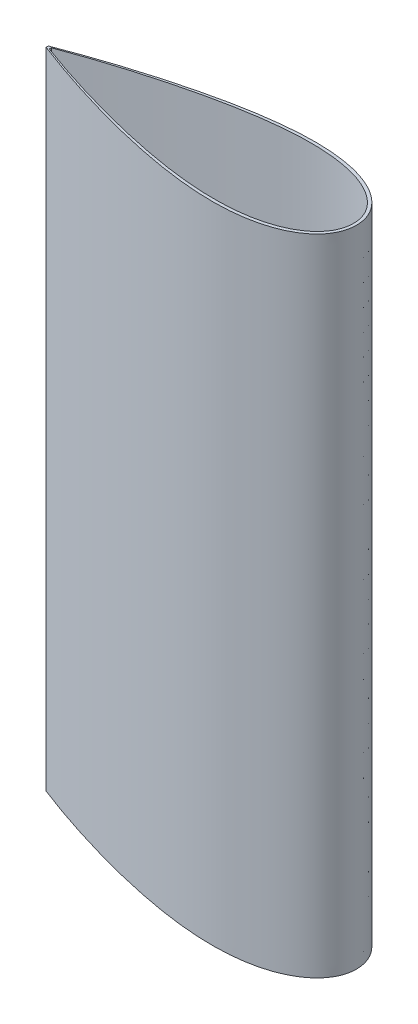
ISO-10303-21;
HEADER;
FILE_DESCRIPTION(('STEP AP214'),'2;1');
FILE_NAME('part.step','',(''),(''),'','','');
FILE_SCHEMA(('AUTOMOTIVE_DESIGN { 1 0 10303 214 1 1 1 1 }'));
ENDSEC;
DATA;
#1=APPLICATION_CONTEXT('core data for automotive mechanical design processes');
#2=APPLICATION_PROTOCOL_DEFINITION('international standard','automotive_design',2000,#1);
#3=PRODUCT_CONTEXT('',#1,'mechanical');
#4=PRODUCT('Part','Part','',(#3));
#5=PRODUCT_RELATED_PRODUCT_CATEGORY('part','',(#4));
#6=PRODUCT_DEFINITION_FORMATION('','',#4);
#7=PRODUCT_DEFINITION_CONTEXT('part definition',#1,'design');
#8=PRODUCT_DEFINITION('design','',#6,#7);
#9=PRODUCT_DEFINITION_SHAPE('','',#8);
#10=(LENGTH_UNIT() NAMED_UNIT(*) SI_UNIT(.MILLI.,.METRE.));
#11=(NAMED_UNIT(*) PLANE_ANGLE_UNIT() SI_UNIT($,.RADIAN.));
#12=(NAMED_UNIT(*) SI_UNIT($,.STERADIAN.) SOLID_ANGLE_UNIT());
#13=UNCERTAINTY_MEASURE_WITH_UNIT(LENGTH_MEASURE(1.E-05),#10,'distance_accuracy_value','');
#14=(GEOMETRIC_REPRESENTATION_CONTEXT(3) GLOBAL_UNCERTAINTY_ASSIGNED_CONTEXT((#13)) GLOBAL_UNIT_ASSIGNED_CONTEXT((#10,
#11,#12)) REPRESENTATION_CONTEXT('',''));
#15=CARTESIAN_POINT('',(0.,0.,0.));
#16=DIRECTION('',(0.,0.,1.));
#17=DIRECTION('',(1.,0.,0.));
#18=AXIS2_PLACEMENT_3D('',#15,#16,#17);
#19=CARTESIAN_POINT('',(-57.12,170.,0.285571439999995));
#20=CARTESIAN_POINT('',(-57.0455040436913,170.,0.314572745868356));
#21=CARTESIAN_POINT('',(-56.7485323313527,170.,0.430183953382638));
#22=CARTESIAN_POINT('',(-56.0834369529126,170.,0.687126258590101));
#23=CARTESIAN_POINT('',(-54.9830200603935,170.,1.10676688529219));
#24=CARTESIAN_POINT('',(-53.4591840988264,170.,1.67652350595603));
#25=CARTESIAN_POINT('',(-51.5285506644977,170.,2.38027267368208));
#26=CARTESIAN_POINT('',(-49.2121777348859,170.,3.19899369320537));
#27=CARTESIAN_POINT('',(-46.5354001673573,170.,4.11183574835229));
#28=CARTESIAN_POINT('',(-43.5275385579,170.,5.09681305864064));
#29=CARTESIAN_POINT('',(-40.2215807512931,170.,6.13128920312645));
#30=CARTESIAN_POINT('',(-36.6538023802164,170.,7.1921156265312));
#31=CARTESIAN_POINT('',(-32.8633459237451,170.,8.25549487940805));
#32=CARTESIAN_POINT('',(-28.8917619051741,170.,9.29666477374203));
#33=CARTESIAN_POINT('',(-24.7825223366046,170.,10.289563981563));
#34=CARTESIAN_POINT('',(-20.5805157372842,170.,11.2066544493525));
#35=CARTESIAN_POINT('',(-16.3315346591188,170.,12.0190608408779));
#36=CARTESIAN_POINT('',(-12.0817671907198,170.,12.6971364503088));
#37=CARTESIAN_POINT('',(-7.87730333001364,170.,13.2114894366209));
#38=CARTESIAN_POINT('',(-3.76366410249902,170.,13.5344153975673));
#39=CARTESIAN_POINT('',(0.214644947786632,170.,13.6415973500571));
#40=CARTESIAN_POINT('',(4.01456395635055,170.,13.5138652685204));
#41=CARTESIAN_POINT('',(7.59491188593086,170.,13.1387628306385));
#42=CARTESIAN_POINT('',(10.9168484106534,170.,12.5116524029219));
#43=CARTESIAN_POINT('',(13.9443788400769,170.,11.6360996118634));
#44=CARTESIAN_POINT('',(16.6448688050116,170.,10.5233265001051));
#45=CARTESIAN_POINT('',(18.9894245660923,170.,9.19061220179104));
#46=CARTESIAN_POINT('',(20.952825011754,170.,7.65877815708307));
#47=CARTESIAN_POINT('',(22.5125070506219,170.,5.9492993484988));
#48=CARTESIAN_POINT('',(23.6466494538324,170.,4.08292406444632));
#49=CARTESIAN_POINT('',(24.3333702997388,170.,2.08071838760882));
#50=CARTESIAN_POINT('',(24.553411984888,170.,0.));
#51=CARTESIAN_POINT('',(24.3333702997388,170.,-2.08071838760879));
#52=CARTESIAN_POINT('',(23.6466494538324,170.,-4.08292406444634));
#53=CARTESIAN_POINT('',(22.5125070506219,170.,-5.94929934849879));
#54=CARTESIAN_POINT('',(20.952825011754,170.,-7.65877815708307));
#55=CARTESIAN_POINT('',(18.9894245660923,170.,-9.19061220179104));
#56=CARTESIAN_POINT('',(16.6448688050116,170.,-10.5233265001051));
#57=CARTESIAN_POINT('',(13.9443788400769,170.,-11.6360996118634));
#58=CARTESIAN_POINT('',(10.9168484106534,170.,-12.5116524029219));
#59=CARTESIAN_POINT('',(7.59491188593088,170.,-13.1387628306385));
#60=CARTESIAN_POINT('',(4.01456395635054,170.,-13.5138652685204));
#61=CARTESIAN_POINT('',(0.214644947786641,170.,-13.6415973500571));
#62=CARTESIAN_POINT('',(-3.76366410249904,170.,-13.5344153975673));
#63=CARTESIAN_POINT('',(-7.87730333001363,170.,-13.2114894366209));
#64=CARTESIAN_POINT('',(-12.0817671907198,170.,-12.6971364503088));
#65=CARTESIAN_POINT('',(-16.3315346591188,170.,-12.0190608408779));
#66=CARTESIAN_POINT('',(-20.5805157372842,170.,-11.2066544493525));
#67=CARTESIAN_POINT('',(-24.7825223366046,170.,-10.289563981563));
#68=CARTESIAN_POINT('',(-28.8917619051741,170.,-9.29666477374203));
#69=CARTESIAN_POINT('',(-32.863345923745,170.,-8.25549487940806));
#70=CARTESIAN_POINT('',(-36.6538023802165,170.,-7.19211562653119));
#71=CARTESIAN_POINT('',(-40.221580751293,170.,-6.13128920312645));
#72=CARTESIAN_POINT('',(-43.5275385579,170.,-5.09681305864064));
#73=CARTESIAN_POINT('',(-46.5354001673573,170.,-4.11183574835229));
#74=CARTESIAN_POINT('',(-49.2121777348859,170.,-3.19899369320537));
#75=CARTESIAN_POINT('',(-51.5285506644977,170.,-2.38027267368209));
#76=CARTESIAN_POINT('',(-53.4591840988264,170.,-1.67652350595602));
#77=CARTESIAN_POINT('',(-54.9830200603936,170.,-1.10676688529219));
#78=CARTESIAN_POINT('',(-56.0834369529126,170.,-0.687126258590097));
#79=CARTESIAN_POINT('',(-56.7485323313527,170.,-0.430183953382643));
#80=CARTESIAN_POINT('',(-57.0455040436913,170.,-0.314572745868356));
#81=CARTESIAN_POINT('',(-57.12,170.,-0.285571439999995));
#82=B_SPLINE_CURVE_WITH_KNOTS('',3,(#19,#20,#21,#22,#23,#24,#25,#26,#27,#28,#29,#30,#31,#32,#33,
#34,#35,#36,#37,#38,#39,#40,#41,#42,#43,#44,#45,#46,#47,#48,#49,#50,#51,#52,#53,#54,#55,#56,#57,
#58,#59,#60,#61,#62,#63,#64,#65,#66,#67,#68,#69,#70,#71,#72,#73,#74,#75,#76,#77,#78,#79,#80,
#81),.UNSPECIFIED.,.F.,.F.,(4,1,1,1,1,1,1,1,1,1,1,1,1,1,1,1,1,1,1,1,1,1,1,1,1,1,1,1,1,1,1,1,1,1,
1,1,1,1,1,1,1,1,1,1,1,1,1,1,1,1,1,1,1,1,1,1,1,1,1,1,4),(0.,0.00133550460978349,
0.00532387407928414,0.0119113210510846,0.0210102439844638,0.0325019435702462,0.0462398233060599,
0.0620526667466603,0.0797476776000696,0.0991131284651801,0.119920646047366,0.141927324835577,
0.164877979564797,0.188507903852281,0.212546489041093,0.236721965478899,0.260767353198259,
0.284427458306147,0.30746645964435,0.329675366373986,0.350878491232694,0.370938188830537,
0.389757543227629,0.407281472463634,0.423497742686769,0.438440368631852,0.452198293510648,
0.46493114032557,0.476889606282727,0.488429493674845,0.5,0.511570506325155,0.523110393717273,
0.53506885967443,0.547801706489352,0.561559631368148,0.576502257313231,0.592718527536366,
0.610242456772371,0.629061811169463,0.649121508767306,0.670324633626014,0.69253354035565,
0.715572541693853,0.739232646801741,0.763278034521101,0.787453510958907,0.811492096147718,
0.835122020435202,0.858072675164423,0.880079353952634,0.90088687153482,0.92025232239993,
0.93794733325334,0.95376017669394,0.967498056429754,0.978989756015536,0.988088678948915,
0.994676125920716,0.998664495390217,1.),.UNSPECIFIED.);
#83=DIRECTION('',(0.,-1.,0.));
#84=VECTOR('',#83,1.);
#85=SURFACE_OF_LINEAR_EXTRUSION('',#82,#84);
#86=CARTESIAN_POINT('',(-57.12,0.,0.285571439999995));
#87=CARTESIAN_POINT('',(-57.0455040436913,0.,0.314572745868356));
#88=CARTESIAN_POINT('',(-56.7485323313527,0.,0.430183953382638));
#89=CARTESIAN_POINT('',(-56.0834369529126,0.,0.687126258590101));
#90=CARTESIAN_POINT('',(-54.9830200603935,0.,1.10676688529219));
#91=CARTESIAN_POINT('',(-53.4591840988264,0.,1.67652350595603));
#92=CARTESIAN_POINT('',(-51.5285506644977,0.,2.38027267368208));
#93=CARTESIAN_POINT('',(-49.2121777348859,0.,3.19899369320537));
#94=CARTESIAN_POINT('',(-46.5354001673573,0.,4.11183574835229));
#95=CARTESIAN_POINT('',(-43.5275385579,0.,5.09681305864064));
#96=CARTESIAN_POINT('',(-40.2215807512931,0.,6.13128920312645));
#97=CARTESIAN_POINT('',(-36.6538023802164,0.,7.1921156265312));
#98=CARTESIAN_POINT('',(-32.8633459237451,0.,8.25549487940805));
#99=CARTESIAN_POINT('',(-28.8917619051741,0.,9.29666477374203));
#100=CARTESIAN_POINT('',(-24.7825223366046,0.,10.289563981563));
#101=CARTESIAN_POINT('',(-20.5805157372842,0.,11.2066544493525));
#102=CARTESIAN_POINT('',(-16.3315346591188,0.,12.0190608408779));
#103=CARTESIAN_POINT('',(-12.0817671907198,0.,12.6971364503088));
#104=CARTESIAN_POINT('',(-7.87730333001364,0.,13.2114894366209));
#105=CARTESIAN_POINT('',(-3.76366410249902,0.,13.5344153975673));
#106=CARTESIAN_POINT('',(0.214644947786632,0.,13.6415973500571));
#107=CARTESIAN_POINT('',(4.01456395635055,0.,13.5138652685204));
#108=CARTESIAN_POINT('',(7.59491188593086,0.,13.1387628306385));
#109=CARTESIAN_POINT('',(10.9168484106534,0.,12.5116524029219));
#110=CARTESIAN_POINT('',(13.9443788400769,0.,11.6360996118634));
#111=CARTESIAN_POINT('',(16.6448688050116,0.,10.5233265001051));
#112=CARTESIAN_POINT('',(18.9894245660923,0.,9.19061220179104));
#113=CARTESIAN_POINT('',(20.952825011754,0.,7.65877815708307));
#114=CARTESIAN_POINT('',(22.5125070506219,0.,5.9492993484988));
#115=CARTESIAN_POINT('',(23.6466494538324,0.,4.08292406444632));
#116=CARTESIAN_POINT('',(24.3333702997388,0.,2.08071838760882));
#117=CARTESIAN_POINT('',(24.553411984888,0.,0.));
#118=CARTESIAN_POINT('',(24.3333702997388,0.,-2.08071838760879));
#119=CARTESIAN_POINT('',(23.6466494538324,0.,-4.08292406444634));
#120=CARTESIAN_POINT('',(22.5125070506219,0.,-5.94929934849879));
#121=CARTESIAN_POINT('',(20.952825011754,0.,-7.65877815708307));
#122=CARTESIAN_POINT('',(18.9894245660923,0.,-9.19061220179104));
#123=CARTESIAN_POINT('',(16.6448688050116,0.,-10.5233265001051));
#124=CARTESIAN_POINT('',(13.9443788400769,0.,-11.6360996118634));
#125=CARTESIAN_POINT('',(10.9168484106534,0.,-12.5116524029219));
#126=CARTESIAN_POINT('',(7.59491188593088,0.,-13.1387628306385));
#127=CARTESIAN_POINT('',(4.01456395635054,0.,-13.5138652685204));
#128=CARTESIAN_POINT('',(0.214644947786641,0.,-13.6415973500571));
#129=CARTESIAN_POINT('',(-3.76366410249904,0.,-13.5344153975673));
#130=CARTESIAN_POINT('',(-7.87730333001363,0.,-13.2114894366209));
#131=CARTESIAN_POINT('',(-12.0817671907198,0.,-12.6971364503088));
#132=CARTESIAN_POINT('',(-16.3315346591188,0.,-12.0190608408779));
#133=CARTESIAN_POINT('',(-20.5805157372842,0.,-11.2066544493525));
#134=CARTESIAN_POINT('',(-24.7825223366046,0.,-10.289563981563));
#135=CARTESIAN_POINT('',(-28.8917619051741,0.,-9.29666477374203));
#136=CARTESIAN_POINT('',(-32.863345923745,0.,-8.25549487940806));
#137=CARTESIAN_POINT('',(-36.6538023802165,0.,-7.19211562653119));
#138=CARTESIAN_POINT('',(-40.221580751293,0.,-6.13128920312645));
#139=CARTESIAN_POINT('',(-43.5275385579,0.,-5.09681305864064));
#140=CARTESIAN_POINT('',(-46.5354001673573,0.,-4.11183574835229));
#141=CARTESIAN_POINT('',(-49.2121777348859,0.,-3.19899369320537));
#142=CARTESIAN_POINT('',(-51.5285506644977,0.,-2.38027267368209));
#143=CARTESIAN_POINT('',(-53.4591840988264,0.,-1.67652350595602));
#144=CARTESIAN_POINT('',(-54.9830200603936,0.,-1.10676688529219));
#145=CARTESIAN_POINT('',(-56.0834369529126,0.,-0.687126258590097));
#146=CARTESIAN_POINT('',(-56.7485323313527,0.,-0.430183953382643));
#147=CARTESIAN_POINT('',(-57.0455040436913,0.,-0.314572745868356));
#148=CARTESIAN_POINT('',(-57.12,0.,-0.285571439999995));
#149=B_SPLINE_CURVE_WITH_KNOTS('',3,(#86,#87,#88,#89,#90,#91,#92,#93,#94,#95,#96,#97,#98,#99,
#100,#101,#102,#103,#104,#105,#106,#107,#108,#109,#110,#111,#112,#113,#114,#115,#116,#117,#118,
#119,#120,#121,#122,#123,#124,#125,#126,#127,#128,#129,#130,#131,#132,#133,#134,#135,#136,#137,
#138,#139,#140,#141,#142,#143,#144,#145,#146,#147,#148),.UNSPECIFIED.,.F.,.F.,(4,1,1,1,1,1,1,1,
1,1,1,1,1,1,1,1,1,1,1,1,1,1,1,1,1,1,1,1,1,1,1,1,1,1,1,1,1,1,1,1,1,1,1,1,1,1,1,1,1,1,1,1,1,1,1,1,
1,1,1,1,4),(0.,0.00133550460978349,0.00532387407928414,0.0119113210510846,0.0210102439844638,
0.0325019435702462,0.0462398233060599,0.0620526667466603,0.0797476776000696,0.0991131284651801,
0.119920646047366,0.141927324835577,0.164877979564797,0.188507903852281,0.212546489041093,
0.236721965478899,0.260767353198259,0.284427458306147,0.30746645964435,0.329675366373986,
0.350878491232694,0.370938188830537,0.389757543227629,0.407281472463634,0.423497742686769,
0.438440368631852,0.452198293510648,0.46493114032557,0.476889606282727,0.488429493674845,0.5,
0.511570506325155,0.523110393717273,0.53506885967443,0.547801706489352,0.561559631368148,
0.576502257313231,0.592718527536366,0.610242456772371,0.629061811169463,0.649121508767306,
0.670324633626014,0.69253354035565,0.715572541693853,0.739232646801741,0.763278034521101,
0.787453510958907,0.811492096147718,0.835122020435202,0.858072675164423,0.880079353952634,
0.90088687153482,0.92025232239993,0.93794733325334,0.95376017669394,0.967498056429754,
0.978989756015536,0.988088678948915,0.994676125920716,0.998664495390217,1.),.UNSPECIFIED.);
#150=CARTESIAN_POINT('',(-57.12,0.,0.285571439999995));
#151=VERTEX_POINT('',#150);
#152=CARTESIAN_POINT('',(-57.12,0.,-0.285571439999995));
#153=VERTEX_POINT('',#152);
#154=EDGE_CURVE('E82',#151,#153,#149,.T.);
#155=ORIENTED_EDGE('',*,*,#154,.T.);
#156=DIRECTION('',(0.,-1.,0.));
#157=VECTOR('',#156,1.);
#158=CARTESIAN_POINT('',(-57.12,170.,-0.285571439999995));
#159=LINE('',#158,#157);
#160=CARTESIAN_POINT('',(-57.12,170.,-0.285571439999995));
#161=VERTEX_POINT('',#160);
#162=EDGE_CURVE('E129',#161,#153,#159,.T.);
#163=ORIENTED_EDGE('',*,*,#162,.F.);
#164=CARTESIAN_POINT('',(-57.12,170.,0.285571439999995));
#165=VERTEX_POINT('',#164);
#166=EDGE_CURVE('E133',#165,#161,#82,.T.);
#167=ORIENTED_EDGE('',*,*,#166,.F.);
#168=DIRECTION('',(0.,-1.,0.));
#169=VECTOR('',#168,1.);
#170=CARTESIAN_POINT('',(-57.12,170.,0.285571439999995));
#171=LINE('',#170,#169);
#172=EDGE_CURVE('E126',#165,#151,#171,.T.);
#173=ORIENTED_EDGE('',*,*,#172,.T.);
#174=EDGE_LOOP('',(#155,#163,#167,#173));
#175=FACE_BOUND('',#174,.T.);
#176=ADVANCED_FACE('F39',(#175),#85,.F.);
#177=CARTESIAN_POINT('',(-57.12,170.,-0.285571439999995));
#178=DIRECTION('',(1.,0.,0.));
#179=DIRECTION('',(0.,0.,-1.));
#180=AXIS2_PLACEMENT_3D('',#177,#178,#179);
#181=PLANE('',#180);
#182=DIRECTION('',(0.,0.,1.));
#183=VECTOR('',#182,1.);
#184=CARTESIAN_POINT('',(-57.12,0.,-0.285571439999995));
#185=LINE('',#184,#183);
#186=EDGE_CURVE('E124',#153,#151,#185,.T.);
#187=ORIENTED_EDGE('',*,*,#186,.T.);
#188=ORIENTED_EDGE('',*,*,#172,.F.);
#189=DIRECTION('',(0.,0.,1.));
#190=VECTOR('',#189,1.);
#191=CARTESIAN_POINT('',(-57.12,170.,-0.285571439999995));
#192=LINE('',#191,#190);
#193=EDGE_CURVE('E136',#161,#165,#192,.T.);
#194=ORIENTED_EDGE('',*,*,#193,.F.);
#195=ORIENTED_EDGE('',*,*,#162,.T.);
#196=EDGE_LOOP('',(#187,#188,#194,#195));
#197=FACE_BOUND('',#196,.T.);
#198=ADVANCED_FACE('F113',(#197),#181,.F.);
#199=CARTESIAN_POINT('',(24.48,170.,0.));
#200=DIRECTION('',(0.,1.,0.));
#201=DIRECTION('',(0.,0.,1.));
#202=AXIS2_PLACEMENT_3D('',#199,#200,#201);
#203=PLANE('',#202);
#204=CARTESIAN_POINT('',(-56.32,170.,0.268799999999995));
#205=CARTESIAN_POINT('',(-56.2469643267356,170.,0.296098233405344));
#206=CARTESIAN_POINT('',(-55.9558007174297,170.,0.404925219051114));
#207=CARTESIAN_POINT('',(-55.3037102059169,170.,0.646790768471191));
#208=CARTESIAN_POINT('',(-54.2248114701945,170.,1.04180716533723));
#209=CARTESIAN_POINT('',(-52.7307841940299,170.,1.57812642792553));
#210=CARTESIAN_POINT('',(-50.8379295415583,170.,2.24056954333758));
#211=CARTESIAN_POINT('',(-48.5668996769928,170.,3.01123000352379));
#212=CARTESIAN_POINT('',(-45.9425365262148,170.,3.87048014740585));
#213=CARTESIAN_POINT('',(-42.9935870924287,170.,4.79762500452711));
#214=CARTESIAN_POINT('',(-39.7523908932478,170.,5.77135810332966));
#215=CARTESIAN_POINT('',(-36.254509087856,170.,6.76989123667013));
#216=CARTESIAN_POINT('',(-32.5383134252465,170.,7.77082510037512));
#217=CARTESIAN_POINT('',(-28.64453863481,170.,8.75085136212827));
#218=CARTESIAN_POINT('',(-24.6158078259284,170.,9.68543747202967));
#219=CARTESIAN_POINT('',(-20.4961397590271,170.,10.5486595027132));
#220=CARTESIAN_POINT('',(-16.3304482991971,170.,11.3133341333292));
#221=CARTESIAN_POINT('',(-12.1640447557857,170.,11.9515531424294));
#222=CARTESIAN_POINT('',(-8.0421530633333,170.,12.4356525393741));
#223=CARTESIAN_POINT('',(-4.00944468273404,170.,12.7395654659105));
#224=CARTESIAN_POINT('',(-0.109594077792035,170.,12.8404274150426));
#225=CARTESIAN_POINT('',(3.61515330462806,170.,12.7202366298925));
#226=CARTESIAN_POINT('',(7.12441847841279,170.,12.3673300093889));
#227=CARTESIAN_POINT('',(10.3801550778295,170.,11.7774193091131));
#228=CARTESIAN_POINT('',(13.347156980407,170.,10.9539425696467));
#229=CARTESIAN_POINT('',(15.9935780761944,170.,9.90752916755095));
#230=CARTESIAN_POINT('',(18.291330539946,170.,8.65444961027305));
#231=CARTESIAN_POINT('',(20.2160487195843,170.,7.21414493052177));
#232=CARTESIAN_POINT('',(21.7460357738055,170.,5.60630003138133));
#233=CARTESIAN_POINT('',(22.8600055729379,170.,3.84941987674208));
#234=CARTESIAN_POINT('',(23.5355429517609,170.,1.96238000337494));
#235=CARTESIAN_POINT('',(23.7521833975553,170.,0.));
#236=CARTESIAN_POINT('',(23.5355429517609,170.,-1.96238000337495));
#237=CARTESIAN_POINT('',(22.8600055729379,170.,-3.84941987674208));
#238=CARTESIAN_POINT('',(21.7460357738055,170.,-5.60630003138132));
#239=CARTESIAN_POINT('',(20.2160487195843,170.,-7.21414493052178));
#240=CARTESIAN_POINT('',(18.291330539946,170.,-8.65444961027304));
#241=CARTESIAN_POINT('',(15.9935780761944,170.,-9.90752916755096));
#242=CARTESIAN_POINT('',(13.347156980407,170.,-10.9539425696467));
#243=CARTESIAN_POINT('',(10.3801550778295,170.,-11.7774193091131));
#244=CARTESIAN_POINT('',(7.12441847841278,170.,-12.3673300093889));
#245=CARTESIAN_POINT('',(3.61515330462806,170.,-12.7202366298925));
#246=CARTESIAN_POINT('',(-0.109594077792035,170.,-12.8404274150426));
#247=CARTESIAN_POINT('',(-4.00944468273404,170.,-12.7395654659105));
#248=CARTESIAN_POINT('',(-8.04215306333332,170.,-12.4356525393741));
#249=CARTESIAN_POINT('',(-12.1640447557856,170.,-11.9515531424294));
#250=CARTESIAN_POINT('',(-16.3304482991971,170.,-11.3133341333292));
#251=CARTESIAN_POINT('',(-20.4961397590271,170.,-10.5486595027132));
#252=CARTESIAN_POINT('',(-24.6158078259285,170.,-9.68543747202967));
#253=CARTESIAN_POINT('',(-28.64453863481,170.,-8.75085136212827));
#254=CARTESIAN_POINT('',(-32.5383134252465,170.,-7.77082510037512));
#255=CARTESIAN_POINT('',(-36.254509087856,170.,-6.76989123667013));
#256=CARTESIAN_POINT('',(-39.7523908932478,170.,-5.77135810332966));
#257=CARTESIAN_POINT('',(-42.9935870924287,170.,-4.79762500452711));
#258=CARTESIAN_POINT('',(-45.9425365262148,170.,-3.87048014740585));
#259=CARTESIAN_POINT('',(-48.5668996769929,170.,-3.01123000352378));
#260=CARTESIAN_POINT('',(-50.8379295415583,170.,-2.24056954333759));
#261=CARTESIAN_POINT('',(-52.7307841940299,170.,-1.57812642792552));
#262=CARTESIAN_POINT('',(-54.2248114701945,170.,-1.04180716533723));
#263=CARTESIAN_POINT('',(-55.3037102059169,170.,-0.646790768471189));
#264=CARTESIAN_POINT('',(-55.9558007174297,170.,-0.404925219051116));
#265=CARTESIAN_POINT('',(-56.2469643267356,170.,-0.296098233405344));
#266=CARTESIAN_POINT('',(-56.32,170.,-0.268799999999995));
#267=B_SPLINE_CURVE_WITH_KNOTS('',3,(#204,#205,#206,#207,#208,#209,#210,#211,#212,#213,#214,
#215,#216,#217,#218,#219,#220,#221,#222,#223,#224,#225,#226,#227,#228,#229,#230,#231,#232,#233,
#234,#235,#236,#237,#238,#239,#240,#241,#242,#243,#244,#245,#246,#247,#248,#249,#250,#251,#252,
#253,#254,#255,#256,#257,#258,#259,#260,#261,#262,#263,#264,#265,#266),.UNSPECIFIED.,.F.,.F.,(4,
1,1,1,1,1,1,1,1,1,1,1,1,1,1,1,1,1,1,1,1,1,1,1,1,1,1,1,1,1,1,1,1,1,1,1,1,1,1,1,1,1,1,1,1,1,1,1,1,
1,1,1,1,1,1,1,1,1,1,1,4),(0.,0.00133611674248424,0.00532655558315043,0.0119181959671473,
0.0210244474721063,0.0325278380397668,0.0462830734824918,0.0621201871012511,0.0798474860476334,
0.0992541501884558,0.120112508826377,0.142180173086302,0.165202311217138,0.188914406241511,
0.213045821923661,0.23732441656672,0.261482280341632,0.285262438915698,0.308426097277885,
0.330759758539342,0.352081437401059,0.372245301226771,0.391144494826437,0.408712654680125,
0.424925602981025,0.43980569287493,0.453431792205325,0.465957010069139,0.477632115104227,
0.488823044997912,0.5,0.511176955002088,0.522367884895773,0.53404298993086,0.546568207794675,
0.56019430712507,0.575074397018975,0.591287345319875,0.608855505173562,0.627754698773229,
0.647918562598941,0.669240241460658,0.691573902722115,0.714737561084302,0.738517719658368,
0.762675583433279,0.786954178076339,0.811085593758489,0.834797688782861,0.857819826913697,
0.879887491173623,0.900745849811544,0.920152513952367,0.937879812898749,0.953716926517508,
0.967472161960233,0.978975552527894,0.988081804032853,0.99467344441685,0.998663883257516,1.),.UNSPECIFIED.);
#268=CARTESIAN_POINT('',(-56.32,170.,0.268799999999995));
#269=VERTEX_POINT('',#268);
#270=CARTESIAN_POINT('',(-56.32,170.,-0.268799999999995));
#271=VERTEX_POINT('',#270);
#272=EDGE_CURVE('E56',#269,#271,#267,.T.);
#273=ORIENTED_EDGE('',*,*,#272,.F.);
#274=DIRECTION('',(0.,0.,1.));
#275=VECTOR('',#274,1.);
#276=CARTESIAN_POINT('',(-56.32,170.,-0.268799999999995));
#277=LINE('',#276,#275);
#278=EDGE_CURVE('E86',#271,#269,#277,.T.);
#279=ORIENTED_EDGE('',*,*,#278,.F.);
#280=EDGE_LOOP('',(#273,#279));
#281=FACE_BOUND('',#280,.T.);
#282=ORIENTED_EDGE('',*,*,#166,.T.);
#283=ORIENTED_EDGE('',*,*,#193,.T.);
#284=EDGE_LOOP('',(#282,#283));
#285=FACE_BOUND('',#284,.T.);
#286=ADVANCED_FACE('F90',(#281,#285),#203,.T.);
#287=CARTESIAN_POINT('',(24.48,0.,0.));
#288=DIRECTION('',(0.,1.,0.));
#289=DIRECTION('',(0.,0.,1.));
#290=AXIS2_PLACEMENT_3D('',#287,#288,#289);
#291=PLANE('',#290);
#292=DIRECTION('',(0.,0.,1.));
#293=VECTOR('',#292,1.);
#294=CARTESIAN_POINT('',(-56.32,0.,0.));
#295=LINE('',#294,#293);
#296=CARTESIAN_POINT('',(-56.32,0.,-0.268799999999995));
#297=VERTEX_POINT('',#296);
#298=CARTESIAN_POINT('',(-56.32,0.,0.268799999999995));
#299=VERTEX_POINT('',#298);
#300=EDGE_CURVE('E49',#297,#299,#295,.T.);
#301=ORIENTED_EDGE('',*,*,#300,.T.);
#302=CARTESIAN_POINT('',(-56.32,0.,0.268799999999995));
#303=CARTESIAN_POINT('',(-56.2469643267356,0.,0.296098233405344));
#304=CARTESIAN_POINT('',(-55.9558007174297,0.,0.404925219051114));
#305=CARTESIAN_POINT('',(-55.3037102059169,0.,0.646790768471191));
#306=CARTESIAN_POINT('',(-54.2248114701945,0.,1.04180716533723));
#307=CARTESIAN_POINT('',(-52.7307841940299,0.,1.57812642792553));
#308=CARTESIAN_POINT('',(-50.8379295415583,0.,2.24056954333758));
#309=CARTESIAN_POINT('',(-48.5668996769928,0.,3.01123000352379));
#310=CARTESIAN_POINT('',(-45.9425365262148,0.,3.87048014740585));
#311=CARTESIAN_POINT('',(-42.9935870924287,0.,4.79762500452711));
#312=CARTESIAN_POINT('',(-39.7523908932478,0.,5.77135810332966));
#313=CARTESIAN_POINT('',(-36.254509087856,0.,6.76989123667013));
#314=CARTESIAN_POINT('',(-32.5383134252465,0.,7.77082510037512));
#315=CARTESIAN_POINT('',(-28.64453863481,0.,8.75085136212827));
#316=CARTESIAN_POINT('',(-24.6158078259284,0.,9.68543747202967));
#317=CARTESIAN_POINT('',(-20.4961397590271,0.,10.5486595027132));
#318=CARTESIAN_POINT('',(-16.3304482991971,0.,11.3133341333292));
#319=CARTESIAN_POINT('',(-12.1640447557857,0.,11.9515531424294));
#320=CARTESIAN_POINT('',(-8.0421530633333,0.,12.4356525393741));
#321=CARTESIAN_POINT('',(-4.00944468273404,0.,12.7395654659105));
#322=CARTESIAN_POINT('',(-0.109594077792035,0.,12.8404274150426));
#323=CARTESIAN_POINT('',(3.61515330462806,0.,12.7202366298925));
#324=CARTESIAN_POINT('',(7.12441847841279,0.,12.3673300093889));
#325=CARTESIAN_POINT('',(10.3801550778295,0.,11.7774193091131));
#326=CARTESIAN_POINT('',(13.347156980407,0.,10.9539425696467));
#327=CARTESIAN_POINT('',(15.9935780761944,0.,9.90752916755095));
#328=CARTESIAN_POINT('',(18.291330539946,0.,8.65444961027305));
#329=CARTESIAN_POINT('',(20.2160487195843,0.,7.21414493052177));
#330=CARTESIAN_POINT('',(21.7460357738055,0.,5.60630003138133));
#331=CARTESIAN_POINT('',(22.8600055729379,0.,3.84941987674208));
#332=CARTESIAN_POINT('',(23.5355429517609,0.,1.96238000337494));
#333=CARTESIAN_POINT('',(23.7521833975553,0.,0.));
#334=CARTESIAN_POINT('',(23.5355429517609,0.,-1.96238000337495));
#335=CARTESIAN_POINT('',(22.8600055729379,0.,-3.84941987674208));
#336=CARTESIAN_POINT('',(21.7460357738055,0.,-5.60630003138132));
#337=CARTESIAN_POINT('',(20.2160487195843,0.,-7.21414493052178));
#338=CARTESIAN_POINT('',(18.291330539946,0.,-8.65444961027304));
#339=CARTESIAN_POINT('',(15.9935780761944,0.,-9.90752916755096));
#340=CARTESIAN_POINT('',(13.347156980407,0.,-10.9539425696467));
#341=CARTESIAN_POINT('',(10.3801550778295,0.,-11.7774193091131));
#342=CARTESIAN_POINT('',(7.12441847841278,0.,-12.3673300093889));
#343=CARTESIAN_POINT('',(3.61515330462806,0.,-12.7202366298925));
#344=CARTESIAN_POINT('',(-0.109594077792035,0.,-12.8404274150426));
#345=CARTESIAN_POINT('',(-4.00944468273404,0.,-12.7395654659105));
#346=CARTESIAN_POINT('',(-8.04215306333332,0.,-12.4356525393741));
#347=CARTESIAN_POINT('',(-12.1640447557856,0.,-11.9515531424294));
#348=CARTESIAN_POINT('',(-16.3304482991971,0.,-11.3133341333292));
#349=CARTESIAN_POINT('',(-20.4961397590271,0.,-10.5486595027132));
#350=CARTESIAN_POINT('',(-24.6158078259285,0.,-9.68543747202967));
#351=CARTESIAN_POINT('',(-28.64453863481,0.,-8.75085136212827));
#352=CARTESIAN_POINT('',(-32.5383134252465,0.,-7.77082510037512));
#353=CARTESIAN_POINT('',(-36.254509087856,0.,-6.76989123667013));
#354=CARTESIAN_POINT('',(-39.7523908932478,0.,-5.77135810332966));
#355=CARTESIAN_POINT('',(-42.9935870924287,0.,-4.79762500452711));
#356=CARTESIAN_POINT('',(-45.9425365262148,0.,-3.87048014740585));
#357=CARTESIAN_POINT('',(-48.5668996769929,0.,-3.01123000352378));
#358=CARTESIAN_POINT('',(-50.8379295415583,0.,-2.24056954333759));
#359=CARTESIAN_POINT('',(-52.7307841940299,0.,-1.57812642792552));
#360=CARTESIAN_POINT('',(-54.2248114701945,0.,-1.04180716533723));
#361=CARTESIAN_POINT('',(-55.3037102059169,0.,-0.646790768471189));
#362=CARTESIAN_POINT('',(-55.9558007174297,0.,-0.404925219051116));
#363=CARTESIAN_POINT('',(-56.2469643267356,0.,-0.296098233405344));
#364=CARTESIAN_POINT('',(-56.32,0.,-0.268799999999995));
#365=B_SPLINE_CURVE_WITH_KNOTS('',3,(#302,#303,#304,#305,#306,#307,#308,#309,#310,#311,#312,
#313,#314,#315,#316,#317,#318,#319,#320,#321,#322,#323,#324,#325,#326,#327,#328,#329,#330,#331,
#332,#333,#334,#335,#336,#337,#338,#339,#340,#341,#342,#343,#344,#345,#346,#347,#348,#349,#350,
#351,#352,#353,#354,#355,#356,#357,#358,#359,#360,#361,#362,#363,#364),.UNSPECIFIED.,.F.,.F.,(4,
1,1,1,1,1,1,1,1,1,1,1,1,1,1,1,1,1,1,1,1,1,1,1,1,1,1,1,1,1,1,1,1,1,1,1,1,1,1,1,1,1,1,1,1,1,1,1,1,
1,1,1,1,1,1,1,1,1,1,1,4),(0.,0.00133611674248424,0.00532655558315043,0.0119181959671473,
0.0210244474721063,0.0325278380397668,0.0462830734824918,0.0621201871012511,0.0798474860476334,
0.0992541501884558,0.120112508826377,0.142180173086302,0.165202311217138,0.188914406241511,
0.213045821923661,0.23732441656672,0.261482280341632,0.285262438915698,0.308426097277885,
0.330759758539342,0.352081437401059,0.372245301226771,0.391144494826437,0.408712654680125,
0.424925602981025,0.43980569287493,0.453431792205325,0.465957010069139,0.477632115104227,
0.488823044997912,0.5,0.511176955002088,0.522367884895773,0.53404298993086,0.546568207794675,
0.56019430712507,0.575074397018975,0.591287345319875,0.608855505173562,0.627754698773229,
0.647918562598941,0.669240241460658,0.691573902722115,0.714737561084302,0.738517719658368,
0.762675583433279,0.786954178076339,0.811085593758489,0.834797688782861,0.857819826913697,
0.879887491173623,0.900745849811544,0.920152513952367,0.937879812898749,0.953716926517508,
0.967472161960233,0.978975552527894,0.988081804032853,0.99467344441685,0.998663883257516,1.),.UNSPECIFIED.);
#366=EDGE_CURVE('E11',#299,#297,#365,.T.);
#367=ORIENTED_EDGE('',*,*,#366,.T.);
#368=EDGE_LOOP('',(#301,#367));
#369=FACE_BOUND('',#368,.T.);
#370=ORIENTED_EDGE('',*,*,#154,.F.);
#371=ORIENTED_EDGE('',*,*,#186,.F.);
#372=EDGE_LOOP('',(#370,#371));
#373=FACE_BOUND('',#372,.T.);
#374=ADVANCED_FACE('F110',(#369,#373),#291,.F.);
#375=CARTESIAN_POINT('',(-56.32,-1.2E-05,0.268799999999995));
#376=CARTESIAN_POINT('',(-56.2469643267356,-1.2E-05,0.296098233405344));
#377=CARTESIAN_POINT('',(-55.9558007174297,-1.2E-05,0.404925219051114));
#378=CARTESIAN_POINT('',(-55.3037102059169,-1.2E-05,0.646790768471191));
#379=CARTESIAN_POINT('',(-54.2248114701945,-1.2E-05,1.04180716533723));
#380=CARTESIAN_POINT('',(-52.7307841940299,-1.2E-05,1.57812642792553));
#381=CARTESIAN_POINT('',(-50.8379295415583,-1.2E-05,2.24056954333758));
#382=CARTESIAN_POINT('',(-48.5668996769928,-1.2E-05,3.01123000352379));
#383=CARTESIAN_POINT('',(-45.9425365262148,-1.2E-05,3.87048014740585));
#384=CARTESIAN_POINT('',(-42.9935870924287,-1.2E-05,4.79762500452711));
#385=CARTESIAN_POINT('',(-39.7523908932478,-1.2E-05,5.77135810332966));
#386=CARTESIAN_POINT('',(-36.254509087856,-1.2E-05,6.76989123667013));
#387=CARTESIAN_POINT('',(-32.5383134252465,-1.2E-05,7.77082510037512));
#388=CARTESIAN_POINT('',(-28.64453863481,-1.2E-05,8.75085136212827));
#389=CARTESIAN_POINT('',(-24.6158078259284,-1.2E-05,9.68543747202967));
#390=CARTESIAN_POINT('',(-20.4961397590271,-1.2E-05,10.5486595027132));
#391=CARTESIAN_POINT('',(-16.3304482991971,-1.2E-05,11.3133341333292));
#392=CARTESIAN_POINT('',(-12.1640447557857,-1.2E-05,11.9515531424294));
#393=CARTESIAN_POINT('',(-8.0421530633333,-1.2E-05,12.4356525393741));
#394=CARTESIAN_POINT('',(-4.00944468273404,-1.2E-05,12.7395654659105));
#395=CARTESIAN_POINT('',(-0.109594077792035,-1.2E-05,12.8404274150426));
#396=CARTESIAN_POINT('',(3.61515330462806,-1.2E-05,12.7202366298925));
#397=CARTESIAN_POINT('',(7.12441847841279,-1.2E-05,12.3673300093889));
#398=CARTESIAN_POINT('',(10.3801550778295,-1.2E-05,11.7774193091131));
#399=CARTESIAN_POINT('',(13.347156980407,-1.2E-05,10.9539425696467));
#400=CARTESIAN_POINT('',(15.9935780761944,-1.2E-05,9.90752916755095));
#401=CARTESIAN_POINT('',(18.291330539946,-1.2E-05,8.65444961027305));
#402=CARTESIAN_POINT('',(20.2160487195843,-1.2E-05,7.21414493052177));
#403=CARTESIAN_POINT('',(21.7460357738055,-1.2E-05,5.60630003138133));
#404=CARTESIAN_POINT('',(22.8600055729379,-1.2E-05,3.84941987674208));
#405=CARTESIAN_POINT('',(23.5355429517609,-1.2E-05,1.96238000337494));
#406=CARTESIAN_POINT('',(23.7521833975553,-1.2E-05,0.));
#407=CARTESIAN_POINT('',(23.5355429517609,-1.2E-05,-1.96238000337495));
#408=CARTESIAN_POINT('',(22.8600055729379,-1.2E-05,-3.84941987674208));
#409=CARTESIAN_POINT('',(21.7460357738055,-1.2E-05,-5.60630003138132));
#410=CARTESIAN_POINT('',(20.2160487195843,-1.2E-05,-7.21414493052178));
#411=CARTESIAN_POINT('',(18.291330539946,-1.2E-05,-8.65444961027304));
#412=CARTESIAN_POINT('',(15.9935780761944,-1.2E-05,-9.90752916755096));
#413=CARTESIAN_POINT('',(13.347156980407,-1.2E-05,-10.9539425696467));
#414=CARTESIAN_POINT('',(10.3801550778295,-1.2E-05,-11.7774193091131));
#415=CARTESIAN_POINT('',(7.12441847841278,-1.2E-05,-12.3673300093889));
#416=CARTESIAN_POINT('',(3.61515330462806,-1.2E-05,-12.7202366298925));
#417=CARTESIAN_POINT('',(-0.109594077792035,-1.2E-05,-12.8404274150426));
#418=CARTESIAN_POINT('',(-4.00944468273404,-1.2E-05,-12.7395654659105));
#419=CARTESIAN_POINT('',(-8.04215306333332,-1.2E-05,-12.4356525393741));
#420=CARTESIAN_POINT('',(-12.1640447557856,-1.2E-05,-11.9515531424294));
#421=CARTESIAN_POINT('',(-16.3304482991971,-1.2E-05,-11.3133341333292));
#422=CARTESIAN_POINT('',(-20.4961397590271,-1.2E-05,-10.5486595027132));
#423=CARTESIAN_POINT('',(-24.6158078259285,-1.2E-05,-9.68543747202967));
#424=CARTESIAN_POINT('',(-28.64453863481,-1.2E-05,-8.75085136212827));
#425=CARTESIAN_POINT('',(-32.5383134252465,-1.2E-05,-7.77082510037512));
#426=CARTESIAN_POINT('',(-36.254509087856,-1.2E-05,-6.76989123667013));
#427=CARTESIAN_POINT('',(-39.7523908932478,-1.2E-05,-5.77135810332966));
#428=CARTESIAN_POINT('',(-42.9935870924287,-1.2E-05,-4.79762500452711));
#429=CARTESIAN_POINT('',(-45.9425365262148,-1.2E-05,-3.87048014740585));
#430=CARTESIAN_POINT('',(-48.5668996769929,-1.2E-05,-3.01123000352378));
#431=CARTESIAN_POINT('',(-50.8379295415583,-1.2E-05,-2.24056954333759));
#432=CARTESIAN_POINT('',(-52.7307841940299,-1.2E-05,-1.57812642792552));
#433=CARTESIAN_POINT('',(-54.2248114701945,-1.2E-05,-1.04180716533723));
#434=CARTESIAN_POINT('',(-55.3037102059169,-1.2E-05,-0.646790768471189));
#435=CARTESIAN_POINT('',(-55.9558007174297,-1.2E-05,-0.404925219051116));
#436=CARTESIAN_POINT('',(-56.2469643267356,-1.2E-05,-0.296098233405344));
#437=CARTESIAN_POINT('',(-56.32,-1.2E-05,-0.268799999999995));
#438=B_SPLINE_CURVE_WITH_KNOTS('',3,(#375,#376,#377,#378,#379,#380,#381,#382,#383,#384,#385,
#386,#387,#388,#389,#390,#391,#392,#393,#394,#395,#396,#397,#398,#399,#400,#401,#402,#403,#404,
#405,#406,#407,#408,#409,#410,#411,#412,#413,#414,#415,#416,#417,#418,#419,#420,#421,#422,#423,
#424,#425,#426,#427,#428,#429,#430,#431,#432,#433,#434,#435,#436,#437),.UNSPECIFIED.,.F.,.F.,(4,
1,1,1,1,1,1,1,1,1,1,1,1,1,1,1,1,1,1,1,1,1,1,1,1,1,1,1,1,1,1,1,1,1,1,1,1,1,1,1,1,1,1,1,1,1,1,1,1,
1,1,1,1,1,1,1,1,1,1,1,4),(0.,0.00133611674248424,0.00532655558315043,0.0119181959671473,
0.0210244474721063,0.0325278380397668,0.0462830734824918,0.0621201871012511,0.0798474860476334,
0.0992541501884558,0.120112508826377,0.142180173086302,0.165202311217138,0.188914406241511,
0.213045821923661,0.23732441656672,0.261482280341632,0.285262438915698,0.308426097277885,
0.330759758539342,0.352081437401059,0.372245301226771,0.391144494826437,0.408712654680125,
0.424925602981025,0.43980569287493,0.453431792205325,0.465957010069139,0.477632115104227,
0.488823044997912,0.5,0.511176955002088,0.522367884895773,0.53404298993086,0.546568207794675,
0.56019430712507,0.575074397018975,0.591287345319875,0.608855505173562,0.627754698773229,
0.647918562598941,0.669240241460658,0.691573902722115,0.714737561084302,0.738517719658368,
0.762675583433279,0.786954178076339,0.811085593758489,0.834797688782861,0.857819826913697,
0.879887491173623,0.900745849811544,0.920152513952367,0.937879812898749,0.953716926517508,
0.967472161960233,0.978975552527894,0.988081804032853,0.99467344441685,0.998663883257516,1.),.UNSPECIFIED.);
#439=DIRECTION('',(0.,1.,0.));
#440=VECTOR('',#439,1.);
#441=SURFACE_OF_LINEAR_EXTRUSION('',#438,#440);
#442=DIRECTION('',(0.,1.,0.));
#443=VECTOR('',#442,1.);
#444=CARTESIAN_POINT('',(-56.32,-1.2E-05,0.268799999999995));
#445=LINE('',#444,#443);
#446=EDGE_CURVE('E63',#299,#269,#445,.T.);
#447=ORIENTED_EDGE('',*,*,#446,.T.);
#448=ORIENTED_EDGE('',*,*,#272,.T.);
#449=DIRECTION('',(0.,1.,0.));
#450=VECTOR('',#449,1.);
#451=CARTESIAN_POINT('',(-56.32,-1.2E-05,-0.268799999999995));
#452=LINE('',#451,#450);
#453=EDGE_CURVE('E83',#297,#271,#452,.T.);
#454=ORIENTED_EDGE('',*,*,#453,.F.);
#455=ORIENTED_EDGE('',*,*,#366,.F.);
#456=EDGE_LOOP('',(#447,#448,#454,#455));
#457=FACE_BOUND('',#456,.T.);
#458=ADVANCED_FACE('F80',(#457),#441,.F.);
#459=CARTESIAN_POINT('',(-56.32,-1.2E-05,-0.268799999999995));
#460=DIRECTION('',(-1.,0.,0.));
#461=DIRECTION('',(0.,0.,1.));
#462=AXIS2_PLACEMENT_3D('',#459,#460,#461);
#463=PLANE('',#462);
#464=ORIENTED_EDGE('',*,*,#453,.T.);
#465=ORIENTED_EDGE('',*,*,#278,.T.);
#466=ORIENTED_EDGE('',*,*,#446,.F.);
#467=ORIENTED_EDGE('',*,*,#300,.F.);
#468=EDGE_LOOP('',(#464,#465,#466,#467));
#469=FACE_BOUND('',#468,.T.);
#470=ADVANCED_FACE('F87',(#469),#463,.F.);
#471=CLOSED_SHELL('',(#176,#198,#286,#374,#458,#470));
#472=MANIFOLD_SOLID_BREP('B2',#471);
#473=ADVANCED_BREP_SHAPE_REPRESENTATION('',(#18,#472),#14);
#474=SHAPE_DEFINITION_REPRESENTATION(#9,#473);
ENDSEC;
END-ISO-10303-21;
